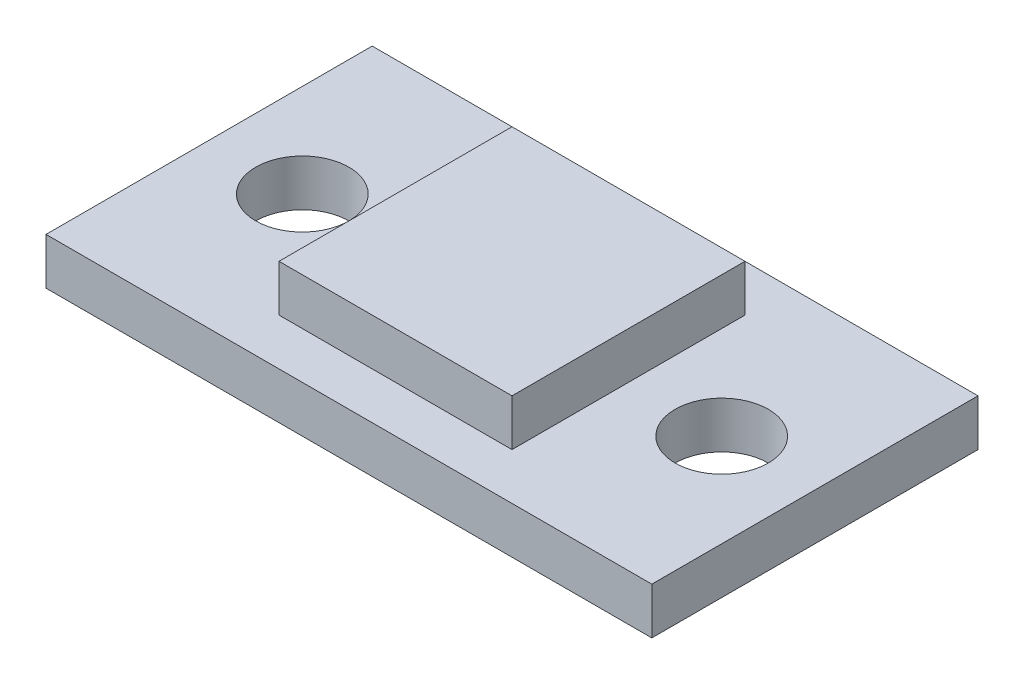
ISO-10303-21;
HEADER;
FILE_DESCRIPTION(('STEP AP214'),'2;1');
FILE_NAME('part.step','',(''),(''),'','','');
FILE_SCHEMA(('AUTOMOTIVE_DESIGN { 1 0 10303 214 1 1 1 1 }'));
ENDSEC;
DATA;
#1=APPLICATION_CONTEXT('core data for automotive mechanical design processes');
#2=APPLICATION_PROTOCOL_DEFINITION('international standard','automotive_design',2000,#1);
#3=PRODUCT_CONTEXT('',#1,'mechanical');
#4=PRODUCT('Part','Part','',(#3));
#5=PRODUCT_RELATED_PRODUCT_CATEGORY('part','',(#4));
#6=PRODUCT_DEFINITION_FORMATION('','',#4);
#7=PRODUCT_DEFINITION_CONTEXT('part definition',#1,'design');
#8=PRODUCT_DEFINITION('design','',#6,#7);
#9=PRODUCT_DEFINITION_SHAPE('','',#8);
#10=(LENGTH_UNIT() NAMED_UNIT(*) SI_UNIT(.MILLI.,.METRE.));
#11=(NAMED_UNIT(*) PLANE_ANGLE_UNIT() SI_UNIT($,.RADIAN.));
#12=(NAMED_UNIT(*) SI_UNIT($,.STERADIAN.) SOLID_ANGLE_UNIT());
#13=UNCERTAINTY_MEASURE_WITH_UNIT(LENGTH_MEASURE(1.E-05),#10,'distance_accuracy_value','');
#14=(GEOMETRIC_REPRESENTATION_CONTEXT(3) GLOBAL_UNCERTAINTY_ASSIGNED_CONTEXT((#13)) GLOBAL_UNIT_ASSIGNED_CONTEXT((#10,
#11,#12)) REPRESENTATION_CONTEXT('',''));
#15=CARTESIAN_POINT('',(0.,0.,0.));
#16=DIRECTION('',(0.,0.,1.));
#17=DIRECTION('',(1.,0.,0.));
#18=AXIS2_PLACEMENT_3D('',#15,#16,#17);
#19=CARTESIAN_POINT('',(-2.5,1.,-2.5));
#20=DIRECTION('',(1.,0.,0.));
#21=DIRECTION('',(0.,0.,-1.));
#22=AXIS2_PLACEMENT_3D('',#19,#20,#21);
#23=PLANE('',#22);
#24=DIRECTION('',(0.,0.,1.));
#25=VECTOR('',#24,1.);
#26=CARTESIAN_POINT('',(-2.5,0.,-2.5));
#27=LINE('',#26,#25);
#28=CARTESIAN_POINT('',(-2.5,0.,-2.5));
#29=VERTEX_POINT('',#28);
#30=CARTESIAN_POINT('',(-2.5,0.,2.5));
#31=VERTEX_POINT('',#30);
#32=EDGE_CURVE('E118',#29,#31,#27,.T.);
#33=ORIENTED_EDGE('',*,*,#32,.T.);
#34=DIRECTION('',(0.,-1.,0.));
#35=VECTOR('',#34,1.);
#36=CARTESIAN_POINT('',(-2.5,1.,2.5));
#37=LINE('',#36,#35);
#38=CARTESIAN_POINT('',(-2.5,1.,2.5));
#39=VERTEX_POINT('',#38);
#40=EDGE_CURVE('E11',#39,#31,#37,.T.);
#41=ORIENTED_EDGE('',*,*,#40,.F.);
#42=DIRECTION('',(0.,0.,1.));
#43=VECTOR('',#42,1.);
#44=CARTESIAN_POINT('',(-2.5,1.,-2.5));
#45=LINE('',#44,#43);
#46=CARTESIAN_POINT('',(-2.5,1.,-2.5));
#47=VERTEX_POINT('',#46);
#48=EDGE_CURVE('E127',#47,#39,#45,.T.);
#49=ORIENTED_EDGE('',*,*,#48,.F.);
#50=DIRECTION('',(0.,-1.,0.));
#51=VECTOR('',#50,1.);
#52=CARTESIAN_POINT('',(-2.5,1.,-2.5));
#53=LINE('',#52,#51);
#54=EDGE_CURVE('E134',#47,#29,#53,.T.);
#55=ORIENTED_EDGE('',*,*,#54,.T.);
#56=EDGE_LOOP('',(#33,#41,#49,#55));
#57=FACE_BOUND('',#56,.T.);
#58=ADVANCED_FACE('F32',(#57),#23,.F.);
#59=CARTESIAN_POINT('',(-2.5,1.,2.5));
#60=DIRECTION('',(0.,0.,-1.));
#61=DIRECTION('',(-1.,0.,0.));
#62=AXIS2_PLACEMENT_3D('',#59,#60,#61);
#63=PLANE('',#62);
#64=DIRECTION('',(1.,0.,0.));
#65=VECTOR('',#64,1.);
#66=CARTESIAN_POINT('',(-2.5,0.,2.5));
#67=LINE('',#66,#65);
#68=CARTESIAN_POINT('',(2.5,0.,2.5));
#69=VERTEX_POINT('',#68);
#70=EDGE_CURVE('E121',#31,#69,#67,.T.);
#71=ORIENTED_EDGE('',*,*,#70,.T.);
#72=DIRECTION('',(0.,-1.,0.));
#73=VECTOR('',#72,1.);
#74=CARTESIAN_POINT('',(2.5,1.,2.5));
#75=LINE('',#74,#73);
#76=CARTESIAN_POINT('',(2.5,1.,2.5));
#77=VERTEX_POINT('',#76);
#78=EDGE_CURVE('E40',#77,#69,#75,.T.);
#79=ORIENTED_EDGE('',*,*,#78,.F.);
#80=DIRECTION('',(1.,0.,0.));
#81=VECTOR('',#80,1.);
#82=CARTESIAN_POINT('',(-2.5,1.,2.5));
#83=LINE('',#82,#81);
#84=EDGE_CURVE('E129',#39,#77,#83,.T.);
#85=ORIENTED_EDGE('',*,*,#84,.F.);
#86=ORIENTED_EDGE('',*,*,#40,.T.);
#87=EDGE_LOOP('',(#71,#79,#85,#86));
#88=FACE_BOUND('',#87,.T.);
#89=ADVANCED_FACE('F154',(#88),#63,.F.);
#90=CARTESIAN_POINT('',(2.5,1.,-2.5));
#91=DIRECTION('',(-1.,0.,0.));
#92=DIRECTION('',(0.,0.,1.));
#93=AXIS2_PLACEMENT_3D('',#90,#91,#92);
#94=PLANE('',#93);
#95=DIRECTION('',(0.,0.,-1.));
#96=VECTOR('',#95,1.);
#97=CARTESIAN_POINT('',(2.5,0.,-2.5));
#98=LINE('',#97,#96);
#99=CARTESIAN_POINT('',(2.5,0.,-2.5));
#100=VERTEX_POINT('',#99);
#101=EDGE_CURVE('E138',#69,#100,#98,.T.);
#102=ORIENTED_EDGE('',*,*,#101,.T.);
#103=DIRECTION('',(0.,-1.,0.));
#104=VECTOR('',#103,1.);
#105=CARTESIAN_POINT('',(2.5,1.,-2.5));
#106=LINE('',#105,#104);
#107=CARTESIAN_POINT('',(2.5,1.,-2.5));
#108=VERTEX_POINT('',#107);
#109=EDGE_CURVE('E145',#108,#100,#106,.T.);
#110=ORIENTED_EDGE('',*,*,#109,.F.);
#111=DIRECTION('',(0.,0.,-1.));
#112=VECTOR('',#111,1.);
#113=CARTESIAN_POINT('',(2.5,1.,-2.5));
#114=LINE('',#113,#112);
#115=EDGE_CURVE('E132',#77,#108,#114,.T.);
#116=ORIENTED_EDGE('',*,*,#115,.F.);
#117=ORIENTED_EDGE('',*,*,#78,.T.);
#118=EDGE_LOOP('',(#102,#110,#116,#117));
#119=FACE_BOUND('',#118,.T.);
#120=ADVANCED_FACE('F151',(#119),#94,.F.);
#121=CARTESIAN_POINT('',(-2.5,1.,-2.5));
#122=DIRECTION('',(0.,0.,1.));
#123=DIRECTION('',(1.,0.,0.));
#124=AXIS2_PLACEMENT_3D('',#121,#122,#123);
#125=PLANE('',#124);
#126=DIRECTION('',(-1.,0.,0.));
#127=VECTOR('',#126,1.);
#128=CARTESIAN_POINT('',(-2.5,0.,-2.5));
#129=LINE('',#128,#127);
#130=EDGE_CURVE('E130',#100,#29,#129,.T.);
#131=ORIENTED_EDGE('',*,*,#130,.T.);
#132=ORIENTED_EDGE('',*,*,#54,.F.);
#133=DIRECTION('',(-1.,0.,0.));
#134=VECTOR('',#133,1.);
#135=CARTESIAN_POINT('',(-2.5,1.,-2.5));
#136=LINE('',#135,#134);
#137=EDGE_CURVE('E47',#108,#47,#136,.T.);
#138=ORIENTED_EDGE('',*,*,#137,.F.);
#139=ORIENTED_EDGE('',*,*,#109,.T.);
#140=EDGE_LOOP('',(#131,#132,#138,#139));
#141=FACE_BOUND('',#140,.T.);
#142=ADVANCED_FACE('F160',(#141),#125,.F.);
#143=CARTESIAN_POINT('',(0.,1.,0.));
#144=DIRECTION('',(0.,1.,0.));
#145=DIRECTION('',(0.,0.,1.));
#146=AXIS2_PLACEMENT_3D('',#143,#144,#145);
#147=PLANE('',#146);
#148=ORIENTED_EDGE('',*,*,#48,.T.);
#149=ORIENTED_EDGE('',*,*,#84,.T.);
#150=ORIENTED_EDGE('',*,*,#115,.T.);
#151=ORIENTED_EDGE('',*,*,#137,.T.);
#152=EDGE_LOOP('',(#148,#149,#150,#151));
#153=FACE_BOUND('',#152,.T.);
#154=ADVANCED_FACE('F163',(#153),#147,.T.);
#155=CARTESIAN_POINT('',(0.,0.,0.));
#156=DIRECTION('',(0.,-1.,0.));
#157=DIRECTION('',(0.,0.,-1.));
#158=AXIS2_PLACEMENT_3D('',#155,#156,#157);
#159=PLANE('',#158);
#160=CARTESIAN_POINT('',(-4.5,0.,0.));
#161=DIRECTION('',(0.,-1.,0.));
#162=DIRECTION('',(0.,0.,1.));
#163=AXIS2_PLACEMENT_3D('',#160,#161,#162);
#164=CIRCLE('',#163,1.);
#165=CARTESIAN_POINT('',(-4.5,0.,1.));
#166=VERTEX_POINT('',#165);
#167=EDGE_CURVE('E269',#166,#166,#164,.T.);
#168=ORIENTED_EDGE('',*,*,#167,.T.);
#169=EDGE_LOOP('',(#168));
#170=FACE_BOUND('',#169,.T.);
#171=DIRECTION('',(0.,0.,-1.));
#172=VECTOR('',#171,1.);
#173=CARTESIAN_POINT('',(-6.5,0.,3.5));
#174=LINE('',#173,#172);
#175=CARTESIAN_POINT('',(-6.5,0.,3.5));
#176=VERTEX_POINT('',#175);
#177=CARTESIAN_POINT('',(-6.5,0.,-3.5));
#178=VERTEX_POINT('',#177);
#179=EDGE_CURVE('E117',#176,#178,#174,.T.);
#180=ORIENTED_EDGE('',*,*,#179,.F.);
#181=DIRECTION('',(-1.,0.,0.));
#182=VECTOR('',#181,1.);
#183=CARTESIAN_POINT('',(-6.5,0.,3.5));
#184=LINE('',#183,#182);
#185=CARTESIAN_POINT('',(6.5,0.,3.5));
#186=VERTEX_POINT('',#185);
#187=EDGE_CURVE('E113',#186,#176,#184,.T.);
#188=ORIENTED_EDGE('',*,*,#187,.F.);
#189=DIRECTION('',(0.,0.,1.));
#190=VECTOR('',#189,1.);
#191=CARTESIAN_POINT('',(6.5,0.,3.5));
#192=LINE('',#191,#190);
#193=CARTESIAN_POINT('',(6.5,0.,-3.5));
#194=VERTEX_POINT('',#193);
#195=EDGE_CURVE('E285',#194,#186,#192,.T.);
#196=ORIENTED_EDGE('',*,*,#195,.F.);
#197=DIRECTION('',(1.,0.,0.));
#198=VECTOR('',#197,1.);
#199=CARTESIAN_POINT('',(-6.5,0.,-3.5));
#200=LINE('',#199,#198);
#201=EDGE_CURVE('E283',#178,#194,#200,.T.);
#202=ORIENTED_EDGE('',*,*,#201,.F.);
#203=EDGE_LOOP('',(#180,#188,#196,#202));
#204=FACE_BOUND('',#203,.T.);
#205=CARTESIAN_POINT('',(4.5,0.,0.));
#206=DIRECTION('',(0.,-1.,0.));
#207=DIRECTION('',(0.,0.,-1.));
#208=AXIS2_PLACEMENT_3D('',#205,#206,#207);
#209=CIRCLE('',#208,1.);
#210=CARTESIAN_POINT('',(4.5,0.,-1.));
#211=VERTEX_POINT('',#210);
#212=EDGE_CURVE('E271',#211,#211,#209,.T.);
#213=ORIENTED_EDGE('',*,*,#212,.T.);
#214=EDGE_LOOP('',(#213));
#215=FACE_BOUND('',#214,.T.);
#216=ORIENTED_EDGE('',*,*,#70,.F.);
#217=ORIENTED_EDGE('',*,*,#32,.F.);
#218=ORIENTED_EDGE('',*,*,#130,.F.);
#219=ORIENTED_EDGE('',*,*,#101,.F.);
#220=EDGE_LOOP('',(#216,#217,#218,#219));
#221=FACE_BOUND('',#220,.T.);
#222=ADVANCED_FACE('F158',(#170,#204,#215,#221),#159,.F.);
#223=CARTESIAN_POINT('',(0.,-1.,0.));
#224=DIRECTION('',(0.,-1.,0.));
#225=DIRECTION('',(0.,0.,-1.));
#226=AXIS2_PLACEMENT_3D('',#223,#224,#225);
#227=PLANE('',#226);
#228=CARTESIAN_POINT('',(4.5,-1.,0.));
#229=DIRECTION('',(0.,-1.,0.));
#230=DIRECTION('',(0.,0.,-1.));
#231=AXIS2_PLACEMENT_3D('',#228,#229,#230);
#232=CIRCLE('',#231,1.);
#233=CARTESIAN_POINT('',(4.5,-1.,-1.));
#234=VERTEX_POINT('',#233);
#235=EDGE_CURVE('E274',#234,#234,#232,.T.);
#236=ORIENTED_EDGE('',*,*,#235,.F.);
#237=EDGE_LOOP('',(#236));
#238=FACE_BOUND('',#237,.T.);
#239=DIRECTION('',(0.,0.,-1.));
#240=VECTOR('',#239,1.);
#241=CARTESIAN_POINT('',(-6.5,-1.,3.5));
#242=LINE('',#241,#240);
#243=CARTESIAN_POINT('',(-6.5,-1.,3.5));
#244=VERTEX_POINT('',#243);
#245=CARTESIAN_POINT('',(-6.5,-1.,-3.5));
#246=VERTEX_POINT('',#245);
#247=EDGE_CURVE('E103',#244,#246,#242,.T.);
#248=ORIENTED_EDGE('',*,*,#247,.T.);
#249=DIRECTION('',(1.,0.,0.));
#250=VECTOR('',#249,1.);
#251=CARTESIAN_POINT('',(-6.5,-1.,-3.5));
#252=LINE('',#251,#250);
#253=CARTESIAN_POINT('',(6.5,-1.,-3.5));
#254=VERTEX_POINT('',#253);
#255=EDGE_CURVE('E92',#246,#254,#252,.T.);
#256=ORIENTED_EDGE('',*,*,#255,.T.);
#257=DIRECTION('',(0.,0.,1.));
#258=VECTOR('',#257,1.);
#259=CARTESIAN_POINT('',(6.5,-1.,3.5));
#260=LINE('',#259,#258);
#261=CARTESIAN_POINT('',(6.5,-1.,3.5));
#262=VERTEX_POINT('',#261);
#263=EDGE_CURVE('E102',#254,#262,#260,.T.);
#264=ORIENTED_EDGE('',*,*,#263,.T.);
#265=DIRECTION('',(-1.,0.,0.));
#266=VECTOR('',#265,1.);
#267=CARTESIAN_POINT('',(-6.5,-1.,3.5));
#268=LINE('',#267,#266);
#269=EDGE_CURVE('E109',#262,#244,#268,.T.);
#270=ORIENTED_EDGE('',*,*,#269,.T.);
#271=EDGE_LOOP('',(#248,#256,#264,#270));
#272=FACE_BOUND('',#271,.T.);
#273=CARTESIAN_POINT('',(-4.5,-1.,0.));
#274=DIRECTION('',(0.,-1.,0.));
#275=DIRECTION('',(0.,0.,1.));
#276=AXIS2_PLACEMENT_3D('',#273,#274,#275);
#277=CIRCLE('',#276,1.);
#278=CARTESIAN_POINT('',(-4.5,-1.,1.));
#279=VERTEX_POINT('',#278);
#280=EDGE_CURVE('E266',#279,#279,#277,.T.);
#281=ORIENTED_EDGE('',*,*,#280,.F.);
#282=EDGE_LOOP('',(#281));
#283=FACE_BOUND('',#282,.T.);
#284=ADVANCED_FACE('F106',(#238,#272,#283),#227,.T.);
#285=CARTESIAN_POINT('',(-6.5,-1.,3.5));
#286=DIRECTION('',(1.,0.,0.));
#287=DIRECTION('',(0.,0.,-1.));
#288=AXIS2_PLACEMENT_3D('',#285,#286,#287);
#289=PLANE('',#288);
#290=ORIENTED_EDGE('',*,*,#179,.T.);
#291=DIRECTION('',(0.,1.,0.));
#292=VECTOR('',#291,1.);
#293=CARTESIAN_POINT('',(-6.5,-1.,-3.5));
#294=LINE('',#293,#292);
#295=EDGE_CURVE('E96',#246,#178,#294,.T.);
#296=ORIENTED_EDGE('',*,*,#295,.F.);
#297=ORIENTED_EDGE('',*,*,#247,.F.);
#298=DIRECTION('',(0.,1.,0.));
#299=VECTOR('',#298,1.);
#300=CARTESIAN_POINT('',(-6.5,-1.,3.5));
#301=LINE('',#300,#299);
#302=EDGE_CURVE('E281',#244,#176,#301,.T.);
#303=ORIENTED_EDGE('',*,*,#302,.T.);
#304=EDGE_LOOP('',(#290,#296,#297,#303));
#305=FACE_BOUND('',#304,.T.);
#306=ADVANCED_FACE('F115',(#305),#289,.F.);
#307=CARTESIAN_POINT('',(-6.5,-1.,-3.5));
#308=DIRECTION('',(0.,0.,1.));
#309=DIRECTION('',(1.,0.,0.));
#310=AXIS2_PLACEMENT_3D('',#307,#308,#309);
#311=PLANE('',#310);
#312=ORIENTED_EDGE('',*,*,#201,.T.);
#313=DIRECTION('',(0.,1.,0.));
#314=VECTOR('',#313,1.);
#315=CARTESIAN_POINT('',(6.5,-1.,-3.5));
#316=LINE('',#315,#314);
#317=EDGE_CURVE('E99',#254,#194,#316,.T.);
#318=ORIENTED_EDGE('',*,*,#317,.F.);
#319=ORIENTED_EDGE('',*,*,#255,.F.);
#320=ORIENTED_EDGE('',*,*,#295,.T.);
#321=EDGE_LOOP('',(#312,#318,#319,#320));
#322=FACE_BOUND('',#321,.T.);
#323=ADVANCED_FACE('F94',(#322),#311,.F.);
#324=CARTESIAN_POINT('',(6.5,-1.,3.5));
#325=DIRECTION('',(-1.,0.,0.));
#326=DIRECTION('',(0.,0.,1.));
#327=AXIS2_PLACEMENT_3D('',#324,#325,#326);
#328=PLANE('',#327);
#329=ORIENTED_EDGE('',*,*,#195,.T.);
#330=DIRECTION('',(0.,1.,0.));
#331=VECTOR('',#330,1.);
#332=CARTESIAN_POINT('',(6.5,-1.,3.5));
#333=LINE('',#332,#331);
#334=EDGE_CURVE('E123',#262,#186,#333,.T.);
#335=ORIENTED_EDGE('',*,*,#334,.F.);
#336=ORIENTED_EDGE('',*,*,#263,.F.);
#337=ORIENTED_EDGE('',*,*,#317,.T.);
#338=EDGE_LOOP('',(#329,#335,#336,#337));
#339=FACE_BOUND('',#338,.T.);
#340=ADVANCED_FACE('F220',(#339),#328,.F.);
#341=CARTESIAN_POINT('',(-6.5,-1.,3.5));
#342=DIRECTION('',(0.,0.,-1.));
#343=DIRECTION('',(-1.,0.,0.));
#344=AXIS2_PLACEMENT_3D('',#341,#342,#343);
#345=PLANE('',#344);
#346=ORIENTED_EDGE('',*,*,#187,.T.);
#347=ORIENTED_EDGE('',*,*,#302,.F.);
#348=ORIENTED_EDGE('',*,*,#269,.F.);
#349=ORIENTED_EDGE('',*,*,#334,.T.);
#350=EDGE_LOOP('',(#346,#347,#348,#349));
#351=FACE_BOUND('',#350,.T.);
#352=ADVANCED_FACE('F229',(#351),#345,.F.);
#353=CARTESIAN_POINT('',(4.5,-1.,0.));
#354=DIRECTION('',(0.,1.,0.));
#355=DIRECTION('',(0.,0.,1.));
#356=AXIS2_PLACEMENT_3D('',#353,#354,#355);
#357=CYLINDRICAL_SURFACE('',#356,1.);
#358=ORIENTED_EDGE('',*,*,#235,.T.);
#359=EDGE_LOOP('',(#358));
#360=FACE_BOUND('',#359,.T.);
#361=ORIENTED_EDGE('',*,*,#212,.F.);
#362=EDGE_LOOP('',(#361));
#363=FACE_BOUND('',#362,.T.);
#364=ADVANCED_FACE('F239',(#360,#363),#357,.F.);
#365=CARTESIAN_POINT('',(-4.5,-1.,0.));
#366=DIRECTION('',(0.,1.,0.));
#367=DIRECTION('',(0.,0.,1.));
#368=AXIS2_PLACEMENT_3D('',#365,#366,#367);
#369=CYLINDRICAL_SURFACE('',#368,1.);
#370=ORIENTED_EDGE('',*,*,#280,.T.);
#371=EDGE_LOOP('',(#370));
#372=FACE_BOUND('',#371,.T.);
#373=ORIENTED_EDGE('',*,*,#167,.F.);
#374=EDGE_LOOP('',(#373));
#375=FACE_BOUND('',#374,.T.);
#376=ADVANCED_FACE('F249',(#372,#375),#369,.F.);
#377=CLOSED_SHELL('',(#58,#89,#120,#142,#154,#222,#284,#306,#323,#340,#352,#364,#376));
#378=MANIFOLD_SOLID_BREP('B2',#377);
#379=ADVANCED_BREP_SHAPE_REPRESENTATION('',(#18,#378),#14);
#380=SHAPE_DEFINITION_REPRESENTATION(#9,#379);
ENDSEC;
END-ISO-10303-21;
